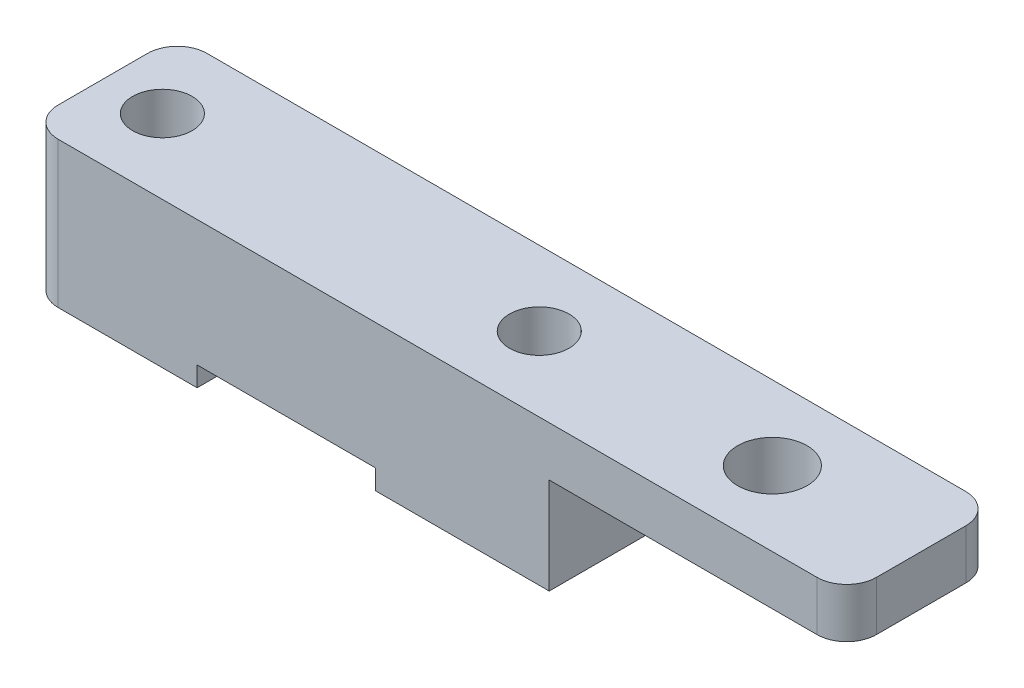
ISO-10303-21;
HEADER;
FILE_DESCRIPTION(('STEP AP214'),'2;1');
FILE_NAME('part.step','',(''),(''),'','','');
FILE_SCHEMA(('AUTOMOTIVE_DESIGN { 1 0 10303 214 1 1 1 1 }'));
ENDSEC;
DATA;
#1=APPLICATION_CONTEXT('core data for automotive mechanical design processes');
#2=APPLICATION_PROTOCOL_DEFINITION('international standard','automotive_design',2000,#1);
#3=PRODUCT_CONTEXT('',#1,'mechanical');
#4=PRODUCT('Part','Part','',(#3));
#5=PRODUCT_RELATED_PRODUCT_CATEGORY('part','',(#4));
#6=PRODUCT_DEFINITION_FORMATION('','',#4);
#7=PRODUCT_DEFINITION_CONTEXT('part definition',#1,'design');
#8=PRODUCT_DEFINITION('design','',#6,#7);
#9=PRODUCT_DEFINITION_SHAPE('','',#8);
#10=(LENGTH_UNIT() NAMED_UNIT(*) SI_UNIT(.MILLI.,.METRE.));
#11=(NAMED_UNIT(*) PLANE_ANGLE_UNIT() SI_UNIT($,.RADIAN.));
#12=(NAMED_UNIT(*) SI_UNIT($,.STERADIAN.) SOLID_ANGLE_UNIT());
#13=UNCERTAINTY_MEASURE_WITH_UNIT(LENGTH_MEASURE(1.E-05),#10,'distance_accuracy_value','');
#14=(GEOMETRIC_REPRESENTATION_CONTEXT(3) GLOBAL_UNCERTAINTY_ASSIGNED_CONTEXT((#13)) GLOBAL_UNIT_ASSIGNED_CONTEXT((#10,
#11,#12)) REPRESENTATION_CONTEXT('',''));
#15=CARTESIAN_POINT('',(0.,0.,0.));
#16=DIRECTION('',(0.,0.,1.));
#17=DIRECTION('',(1.,0.,0.));
#18=AXIS2_PLACEMENT_3D('',#15,#16,#17);
#19=CARTESIAN_POINT('',(16.25,2.65,0.));
#20=DIRECTION('',(0.,0.,1.));
#21=DIRECTION('',(1.,0.,0.));
#22=AXIS2_PLACEMENT_3D('',#19,#20,#21);
#23=PLANE('',#22);
#24=DIRECTION('',(0.,-1.,0.));
#25=VECTOR('',#24,1.);
#26=CARTESIAN_POINT('',(-22.,6.325,0.));
#27=LINE('',#26,#25);
#28=CARTESIAN_POINT('',(-22.,10.,0.));
#29=VERTEX_POINT('',#28);
#30=CARTESIAN_POINT('',(-22.,-4.7,0.));
#31=VERTEX_POINT('',#30);
#32=EDGE_CURVE('E307',#29,#31,#27,.T.);
#33=ORIENTED_EDGE('',*,*,#32,.F.);
#34=DIRECTION('',(1.,0.,0.));
#35=VECTOR('',#34,1.);
#36=CARTESIAN_POINT('',(10.,10.,0.));
#37=LINE('',#36,#35);
#38=CARTESIAN_POINT('',(54.5,10.,0.));
#39=VERTEX_POINT('',#38);
#40=EDGE_CURVE('E269',#29,#39,#37,.T.);
#41=ORIENTED_EDGE('',*,*,#40,.T.);
#42=DIRECTION('',(0.,1.,0.));
#43=VECTOR('',#42,1.);
#44=CARTESIAN_POINT('',(54.5,3.825,0.));
#45=LINE('',#44,#43);
#46=CARTESIAN_POINT('',(54.5,5.,0.));
#47=VERTEX_POINT('',#46);
#48=EDGE_CURVE('E193',#47,#39,#45,.T.);
#49=ORIENTED_EDGE('',*,*,#48,.F.);
#50=DIRECTION('',(-1.,0.,0.));
#51=VECTOR('',#50,1.);
#52=CARTESIAN_POINT('',(57.5,5.,0.));
#53=LINE('',#52,#51);
#54=CARTESIAN_POINT('',(27.5,5.,0.));
#55=VERTEX_POINT('',#54);
#56=EDGE_CURVE('E188',#47,#55,#53,.T.);
#57=ORIENTED_EDGE('',*,*,#56,.T.);
#58=DIRECTION('',(0.,-1.,0.));
#59=VECTOR('',#58,1.);
#60=CARTESIAN_POINT('',(27.5,5.,0.));
#61=LINE('',#60,#59);
#62=CARTESIAN_POINT('',(27.5,-4.7,0.));
#63=VERTEX_POINT('',#62);
#64=EDGE_CURVE('E181',#55,#63,#61,.T.);
#65=ORIENTED_EDGE('',*,*,#64,.T.);
#66=DIRECTION('',(-1.,0.,0.));
#67=VECTOR('',#66,1.);
#68=CARTESIAN_POINT('',(27.5,-4.7,0.));
#69=LINE('',#68,#67);
#70=CARTESIAN_POINT('',(10.,-4.7,0.));
#71=VERTEX_POINT('',#70);
#72=EDGE_CURVE('E231',#63,#71,#69,.T.);
#73=ORIENTED_EDGE('',*,*,#72,.T.);
#74=DIRECTION('',(0.,-1.,0.));
#75=VECTOR('',#74,1.);
#76=CARTESIAN_POINT('',(10.,-2.7,0.));
#77=LINE('',#76,#75);
#78=CARTESIAN_POINT('',(10.,-2.7,0.));
#79=VERTEX_POINT('',#78);
#80=EDGE_CURVE('E230',#79,#71,#77,.T.);
#81=ORIENTED_EDGE('',*,*,#80,.F.);
#82=DIRECTION('',(1.,0.,0.));
#83=VECTOR('',#82,1.);
#84=CARTESIAN_POINT('',(-8.,-2.7,0.));
#85=LINE('',#84,#83);
#86=CARTESIAN_POINT('',(-8.,-2.7,0.));
#87=VERTEX_POINT('',#86);
#88=EDGE_CURVE('E10',#87,#79,#85,.T.);
#89=ORIENTED_EDGE('',*,*,#88,.F.);
#90=DIRECTION('',(0.,1.,0.));
#91=VECTOR('',#90,1.);
#92=CARTESIAN_POINT('',(-8.,-4.7,0.));
#93=LINE('',#92,#91);
#94=CARTESIAN_POINT('',(-8.,-4.7,0.));
#95=VERTEX_POINT('',#94);
#96=EDGE_CURVE('E300',#95,#87,#93,.T.);
#97=ORIENTED_EDGE('',*,*,#96,.F.);
#98=DIRECTION('',(-1.,0.,0.));
#99=VECTOR('',#98,1.);
#100=CARTESIAN_POINT('',(-8.,-4.7,0.));
#101=LINE('',#100,#99);
#102=EDGE_CURVE('E204',#95,#31,#101,.T.);
#103=ORIENTED_EDGE('',*,*,#102,.T.);
#104=EDGE_LOOP('',(#33,#41,#49,#57,#65,#73,#81,#89,#97,#103));
#105=FACE_BOUND('',#104,.T.);
#106=ADVANCED_FACE('F15',(#105),#23,.F.);
#107=CARTESIAN_POINT('',(-8.,-2.7,0.));
#108=DIRECTION('',(0.,-1.,0.));
#109=DIRECTION('',(0.,0.,-1.));
#110=AXIS2_PLACEMENT_3D('',#107,#108,#109);
#111=PLANE('',#110);
#112=ORIENTED_EDGE('',*,*,#88,.T.);
#113=DIRECTION('',(0.,0.,1.));
#114=VECTOR('',#113,1.);
#115=CARTESIAN_POINT('',(10.,-2.7,0.));
#116=LINE('',#115,#114);
#117=CARTESIAN_POINT('',(10.,-2.7,15.));
#118=VERTEX_POINT('',#117);
#119=EDGE_CURVE('E26',#79,#118,#116,.T.);
#120=ORIENTED_EDGE('',*,*,#119,.T.);
#121=DIRECTION('',(1.,0.,0.));
#122=VECTOR('',#121,1.);
#123=CARTESIAN_POINT('',(-8.,-2.7,15.));
#124=LINE('',#123,#122);
#125=CARTESIAN_POINT('',(-8.,-2.7,15.));
#126=VERTEX_POINT('',#125);
#127=EDGE_CURVE('E268',#126,#118,#124,.T.);
#128=ORIENTED_EDGE('',*,*,#127,.F.);
#129=DIRECTION('',(0.,0.,1.));
#130=VECTOR('',#129,1.);
#131=CARTESIAN_POINT('',(-8.,-2.7,0.));
#132=LINE('',#131,#130);
#133=EDGE_CURVE('E235',#87,#126,#132,.T.);
#134=ORIENTED_EDGE('',*,*,#133,.F.);
#135=EDGE_LOOP('',(#112,#120,#128,#134));
#136=FACE_BOUND('',#135,.T.);
#137=ADVANCED_FACE('F440',(#136),#111,.T.);
#138=CARTESIAN_POINT('',(10.,-2.7,0.));
#139=DIRECTION('',(-1.,0.,0.));
#140=DIRECTION('',(0.,0.,1.));
#141=AXIS2_PLACEMENT_3D('',#138,#139,#140);
#142=PLANE('',#141);
#143=ORIENTED_EDGE('',*,*,#80,.T.);
#144=DIRECTION('',(0.,0.,1.));
#145=VECTOR('',#144,1.);
#146=CARTESIAN_POINT('',(10.,-4.7,0.));
#147=LINE('',#146,#145);
#148=CARTESIAN_POINT('',(10.,-4.7,15.));
#149=VERTEX_POINT('',#148);
#150=EDGE_CURVE('E228',#71,#149,#147,.T.);
#151=ORIENTED_EDGE('',*,*,#150,.T.);
#152=DIRECTION('',(0.,-1.,0.));
#153=VECTOR('',#152,1.);
#154=CARTESIAN_POINT('',(10.,-2.7,15.));
#155=LINE('',#154,#153);
#156=EDGE_CURVE('E358',#118,#149,#155,.T.);
#157=ORIENTED_EDGE('',*,*,#156,.F.);
#158=ORIENTED_EDGE('',*,*,#119,.F.);
#159=EDGE_LOOP('',(#143,#151,#157,#158));
#160=FACE_BOUND('',#159,.T.);
#161=ADVANCED_FACE('F434',(#160),#142,.T.);
#162=CARTESIAN_POINT('',(10.,-4.7,0.));
#163=DIRECTION('',(0.,-1.,0.));
#164=DIRECTION('',(0.,0.,-1.));
#165=AXIS2_PLACEMENT_3D('',#162,#163,#164);
#166=PLANE('',#165);
#167=CARTESIAN_POINT('',(19.,-4.7,7.5));
#168=DIRECTION('',(0.,1.,0.));
#169=DIRECTION('',(-1.,0.,0.));
#170=AXIS2_PLACEMENT_3D('',#167,#168,#169);
#171=CIRCLE('',#170,3.);
#172=CARTESIAN_POINT('',(22.,-4.7,7.5));
#173=VERTEX_POINT('',#172);
#174=EDGE_CURVE('E221',#173,#173,#171,.T.);
#175=ORIENTED_EDGE('',*,*,#174,.T.);
#176=EDGE_LOOP('',(#175));
#177=FACE_BOUND('',#176,.T.);
#178=ORIENTED_EDGE('',*,*,#72,.F.);
#179=DIRECTION('',(0.,0.,1.));
#180=VECTOR('',#179,1.);
#181=CARTESIAN_POINT('',(27.5,-4.7,0.));
#182=LINE('',#181,#180);
#183=CARTESIAN_POINT('',(27.5,-4.7,15.));
#184=VERTEX_POINT('',#183);
#185=EDGE_CURVE('E184',#63,#184,#182,.T.);
#186=ORIENTED_EDGE('',*,*,#185,.T.);
#187=DIRECTION('',(1.,0.,0.));
#188=VECTOR('',#187,1.);
#189=CARTESIAN_POINT('',(27.5,-4.7,15.));
#190=LINE('',#189,#188);
#191=EDGE_CURVE('E214',#149,#184,#190,.T.);
#192=ORIENTED_EDGE('',*,*,#191,.F.);
#193=ORIENTED_EDGE('',*,*,#150,.F.);
#194=EDGE_LOOP('',(#178,#186,#192,#193));
#195=FACE_BOUND('',#194,.T.);
#196=ADVANCED_FACE('F17',(#177,#195),#166,.T.);
#197=CARTESIAN_POINT('',(27.5,-4.7,0.));
#198=DIRECTION('',(1.,0.,0.));
#199=DIRECTION('',(0.,1.,0.));
#200=AXIS2_PLACEMENT_3D('',#197,#198,#199);
#201=PLANE('',#200);
#202=ORIENTED_EDGE('',*,*,#64,.F.);
#203=DIRECTION('',(0.,0.,1.));
#204=VECTOR('',#203,1.);
#205=CARTESIAN_POINT('',(27.5,5.,0.));
#206=LINE('',#205,#204);
#207=CARTESIAN_POINT('',(27.5,5.,15.));
#208=VERTEX_POINT('',#207);
#209=EDGE_CURVE('E137',#55,#208,#206,.T.);
#210=ORIENTED_EDGE('',*,*,#209,.T.);
#211=DIRECTION('',(0.,1.,0.));
#212=VECTOR('',#211,1.);
#213=CARTESIAN_POINT('',(27.5,5.,15.));
#214=LINE('',#213,#212);
#215=EDGE_CURVE('E19',#184,#208,#214,.T.);
#216=ORIENTED_EDGE('',*,*,#215,.F.);
#217=ORIENTED_EDGE('',*,*,#185,.F.);
#218=EDGE_LOOP('',(#202,#210,#216,#217));
#219=FACE_BOUND('',#218,.T.);
#220=ADVANCED_FACE('F183',(#219),#201,.T.);
#221=CARTESIAN_POINT('',(27.5,5.,0.));
#222=DIRECTION('',(0.,-1.,0.));
#223=DIRECTION('',(0.,0.,-1.));
#224=AXIS2_PLACEMENT_3D('',#221,#222,#223);
#225=PLANE('',#224);
#226=CARTESIAN_POINT('',(42.5,5.,7.5));
#227=DIRECTION('',(0.,1.,0.));
#228=DIRECTION('',(-1.,0.,0.));
#229=AXIS2_PLACEMENT_3D('',#226,#227,#228);
#230=CIRCLE('',#229,3.5);
#231=CARTESIAN_POINT('',(46.,5.,7.5));
#232=VERTEX_POINT('',#231);
#233=EDGE_CURVE('E147',#232,#232,#230,.T.);
#234=ORIENTED_EDGE('',*,*,#233,.T.);
#235=EDGE_LOOP('',(#234));
#236=FACE_BOUND('',#235,.T.);
#237=CARTESIAN_POINT('',(54.5,5.,3.));
#238=DIRECTION('',(0.,1.,0.));
#239=DIRECTION('',(0.707106781186546,0.,-0.707106781186549));
#240=AXIS2_PLACEMENT_3D('',#237,#238,#239);
#241=CIRCLE('',#240,3.);
#242=CARTESIAN_POINT('',(57.5,5.,3.));
#243=VERTEX_POINT('',#242);
#244=EDGE_CURVE('E283',#243,#47,#241,.T.);
#245=ORIENTED_EDGE('',*,*,#244,.F.);
#246=DIRECTION('',(0.,0.,1.));
#247=VECTOR('',#246,1.);
#248=CARTESIAN_POINT('',(57.5,5.,0.));
#249=LINE('',#248,#247);
#250=CARTESIAN_POINT('',(57.5,5.,12.));
#251=VERTEX_POINT('',#250);
#252=EDGE_CURVE('E276',#243,#251,#249,.T.);
#253=ORIENTED_EDGE('',*,*,#252,.T.);
#254=CARTESIAN_POINT('',(54.5,5.,12.));
#255=DIRECTION('',(0.,1.,0.));
#256=DIRECTION('',(0.707106781186546,0.,0.707106781186549));
#257=AXIS2_PLACEMENT_3D('',#254,#255,#256);
#258=CIRCLE('',#257,3.);
#259=CARTESIAN_POINT('',(54.5,5.,15.));
#260=VERTEX_POINT('',#259);
#261=EDGE_CURVE('E249',#260,#251,#258,.T.);
#262=ORIENTED_EDGE('',*,*,#261,.F.);
#263=DIRECTION('',(1.,0.,0.));
#264=VECTOR('',#263,1.);
#265=CARTESIAN_POINT('',(57.5,5.,15.));
#266=LINE('',#265,#264);
#267=EDGE_CURVE('E201',#208,#260,#266,.T.);
#268=ORIENTED_EDGE('',*,*,#267,.F.);
#269=ORIENTED_EDGE('',*,*,#209,.F.);
#270=ORIENTED_EDGE('',*,*,#56,.F.);
#271=EDGE_LOOP('',(#245,#253,#262,#268,#269,#270));
#272=FACE_BOUND('',#271,.T.);
#273=ADVANCED_FACE('F199',(#236,#272),#225,.T.);
#274=CARTESIAN_POINT('',(-25.,-4.7,0.));
#275=DIRECTION('',(0.,-1.,0.));
#276=DIRECTION('',(0.,0.,-1.));
#277=AXIS2_PLACEMENT_3D('',#274,#275,#276);
#278=PLANE('',#277);
#279=CARTESIAN_POINT('',(-19.,-4.7,7.5));
#280=DIRECTION('',(0.,1.,0.));
#281=DIRECTION('',(-1.,0.,0.));
#282=AXIS2_PLACEMENT_3D('',#279,#280,#281);
#283=CIRCLE('',#282,3.);
#284=CARTESIAN_POINT('',(-16.,-4.7,7.5));
#285=VERTEX_POINT('',#284);
#286=EDGE_CURVE('E220',#285,#285,#283,.T.);
#287=ORIENTED_EDGE('',*,*,#286,.T.);
#288=EDGE_LOOP('',(#287));
#289=FACE_BOUND('',#288,.T.);
#290=CARTESIAN_POINT('',(-22.,-4.7,3.));
#291=DIRECTION('',(0.,1.,0.));
#292=DIRECTION('',(-0.707106781186547,0.,-0.707106781186548));
#293=AXIS2_PLACEMENT_3D('',#290,#291,#292);
#294=CIRCLE('',#293,3.);
#295=CARTESIAN_POINT('',(-25.,-4.7,3.));
#296=VERTEX_POINT('',#295);
#297=EDGE_CURVE('E227',#31,#296,#294,.T.);
#298=ORIENTED_EDGE('',*,*,#297,.F.);
#299=ORIENTED_EDGE('',*,*,#102,.F.);
#300=DIRECTION('',(0.,0.,1.));
#301=VECTOR('',#300,1.);
#302=CARTESIAN_POINT('',(-8.,-4.7,0.));
#303=LINE('',#302,#301);
#304=CARTESIAN_POINT('',(-8.,-4.7,15.));
#305=VERTEX_POINT('',#304);
#306=EDGE_CURVE('E210',#95,#305,#303,.T.);
#307=ORIENTED_EDGE('',*,*,#306,.T.);
#308=DIRECTION('',(1.,0.,0.));
#309=VECTOR('',#308,1.);
#310=CARTESIAN_POINT('',(-8.,-4.7,15.));
#311=LINE('',#310,#309);
#312=CARTESIAN_POINT('',(-22.,-4.7,15.));
#313=VERTEX_POINT('',#312);
#314=EDGE_CURVE('E252',#313,#305,#311,.T.);
#315=ORIENTED_EDGE('',*,*,#314,.F.);
#316=CARTESIAN_POINT('',(-22.,-4.7,12.));
#317=DIRECTION('',(0.,1.,0.));
#318=DIRECTION('',(-0.707106781186547,0.,0.707106781186548));
#319=AXIS2_PLACEMENT_3D('',#316,#317,#318);
#320=CIRCLE('',#319,3.);
#321=CARTESIAN_POINT('',(-25.,-4.7,12.));
#322=VERTEX_POINT('',#321);
#323=EDGE_CURVE('E244',#322,#313,#320,.T.);
#324=ORIENTED_EDGE('',*,*,#323,.F.);
#325=DIRECTION('',(0.,0.,1.));
#326=VECTOR('',#325,1.);
#327=CARTESIAN_POINT('',(-25.,-4.7,0.));
#328=LINE('',#327,#326);
#329=EDGE_CURVE('E245',#296,#322,#328,.T.);
#330=ORIENTED_EDGE('',*,*,#329,.F.);
#331=EDGE_LOOP('',(#298,#299,#307,#315,#324,#330));
#332=FACE_BOUND('',#331,.T.);
#333=ADVANCED_FACE('F411',(#289,#332),#278,.T.);
#334=CARTESIAN_POINT('',(-8.,-4.7,0.));
#335=DIRECTION('',(1.,0.,0.));
#336=DIRECTION('',(0.,1.,0.));
#337=AXIS2_PLACEMENT_3D('',#334,#335,#336);
#338=PLANE('',#337);
#339=ORIENTED_EDGE('',*,*,#96,.T.);
#340=ORIENTED_EDGE('',*,*,#133,.T.);
#341=DIRECTION('',(0.,1.,0.));
#342=VECTOR('',#341,1.);
#343=CARTESIAN_POINT('',(-8.,-4.7,15.));
#344=LINE('',#343,#342);
#345=EDGE_CURVE('E264',#305,#126,#344,.T.);
#346=ORIENTED_EDGE('',*,*,#345,.F.);
#347=ORIENTED_EDGE('',*,*,#306,.F.);
#348=EDGE_LOOP('',(#339,#340,#346,#347));
#349=FACE_BOUND('',#348,.T.);
#350=ADVANCED_FACE('F444',(#349),#338,.T.);
#351=CARTESIAN_POINT('',(-19.,10.,7.5));
#352=DIRECTION('',(0.,-1.,0.));
#353=DIRECTION('',(-1.,0.,0.));
#354=AXIS2_PLACEMENT_3D('',#351,#352,#353);
#355=CYLINDRICAL_SURFACE('',#354,3.);
#356=CARTESIAN_POINT('',(-19.,10.,7.5));
#357=DIRECTION('',(0.,-1.,0.));
#358=DIRECTION('',(-1.,0.,0.));
#359=AXIS2_PLACEMENT_3D('',#356,#357,#358);
#360=CIRCLE('',#359,3.);
#361=CARTESIAN_POINT('',(-16.,10.,7.5));
#362=VERTEX_POINT('',#361);
#363=EDGE_CURVE('E257',#362,#362,#360,.T.);
#364=ORIENTED_EDGE('',*,*,#363,.F.);
#365=DIRECTION('',(0.,-1.,0.));
#366=VECTOR('',#365,1.);
#367=CARTESIAN_POINT('',(-16.,10.,7.5));
#368=LINE('',#367,#366);
#369=EDGE_CURVE('E216',#362,#285,#368,.T.);
#370=ORIENTED_EDGE('',*,*,#369,.T.);
#371=ORIENTED_EDGE('',*,*,#286,.F.);
#372=ORIENTED_EDGE('',*,*,#369,.F.);
#373=EDGE_LOOP('',(#364,#370,#371,#372));
#374=FACE_BOUND('',#373,.T.);
#375=ADVANCED_FACE('F425',(#374),#355,.F.);
#376=CARTESIAN_POINT('',(19.,10.,7.5));
#377=DIRECTION('',(0.,-1.,0.));
#378=DIRECTION('',(-1.,0.,0.));
#379=AXIS2_PLACEMENT_3D('',#376,#377,#378);
#380=CYLINDRICAL_SURFACE('',#379,3.);
#381=CARTESIAN_POINT('',(19.,10.,7.5));
#382=DIRECTION('',(0.,-1.,0.));
#383=DIRECTION('',(-1.,0.,0.));
#384=AXIS2_PLACEMENT_3D('',#381,#382,#383);
#385=CIRCLE('',#384,3.);
#386=CARTESIAN_POINT('',(22.,10.,7.5));
#387=VERTEX_POINT('',#386);
#388=EDGE_CURVE('E253',#387,#387,#385,.T.);
#389=ORIENTED_EDGE('',*,*,#388,.F.);
#390=DIRECTION('',(0.,-1.,0.));
#391=VECTOR('',#390,1.);
#392=CARTESIAN_POINT('',(22.,10.,7.5));
#393=LINE('',#392,#391);
#394=EDGE_CURVE('E236',#387,#173,#393,.T.);
#395=ORIENTED_EDGE('',*,*,#394,.T.);
#396=ORIENTED_EDGE('',*,*,#174,.F.);
#397=ORIENTED_EDGE('',*,*,#394,.F.);
#398=EDGE_LOOP('',(#389,#395,#396,#397));
#399=FACE_BOUND('',#398,.T.);
#400=ADVANCED_FACE('F429',(#399),#380,.F.);
#401=CARTESIAN_POINT('',(42.5,10.,7.5));
#402=DIRECTION('',(0.,-1.,0.));
#403=DIRECTION('',(-1.,0.,0.));
#404=AXIS2_PLACEMENT_3D('',#401,#402,#403);
#405=CYLINDRICAL_SURFACE('',#404,3.5);
#406=CARTESIAN_POINT('',(42.5,10.,7.5));
#407=DIRECTION('',(0.,-1.,0.));
#408=DIRECTION('',(-1.,0.,0.));
#409=AXIS2_PLACEMENT_3D('',#406,#407,#408);
#410=CIRCLE('',#409,3.5);
#411=CARTESIAN_POINT('',(46.,10.,7.5));
#412=VERTEX_POINT('',#411);
#413=EDGE_CURVE('E258',#412,#412,#410,.T.);
#414=ORIENTED_EDGE('',*,*,#413,.F.);
#415=DIRECTION('',(0.,-1.,0.));
#416=VECTOR('',#415,1.);
#417=CARTESIAN_POINT('',(46.,10.,7.5));
#418=LINE('',#417,#416);
#419=EDGE_CURVE('E248',#412,#232,#418,.T.);
#420=ORIENTED_EDGE('',*,*,#419,.T.);
#421=ORIENTED_EDGE('',*,*,#233,.F.);
#422=ORIENTED_EDGE('',*,*,#419,.F.);
#423=EDGE_LOOP('',(#414,#420,#421,#422));
#424=FACE_BOUND('',#423,.T.);
#425=ADVANCED_FACE('F390',(#424),#405,.F.);
#426=CARTESIAN_POINT('',(16.25,2.65,15.));
#427=DIRECTION('',(0.,0.,1.));
#428=DIRECTION('',(1.,0.,0.));
#429=AXIS2_PLACEMENT_3D('',#426,#427,#428);
#430=PLANE('',#429);
#431=DIRECTION('',(0.,1.,0.));
#432=VECTOR('',#431,1.);
#433=CARTESIAN_POINT('',(-22.,6.325,15.));
#434=LINE('',#433,#432);
#435=CARTESIAN_POINT('',(-22.,10.,15.));
#436=VERTEX_POINT('',#435);
#437=EDGE_CURVE('E74',#313,#436,#434,.T.);
#438=ORIENTED_EDGE('',*,*,#437,.F.);
#439=ORIENTED_EDGE('',*,*,#314,.T.);
#440=ORIENTED_EDGE('',*,*,#345,.T.);
#441=ORIENTED_EDGE('',*,*,#127,.T.);
#442=ORIENTED_EDGE('',*,*,#156,.T.);
#443=ORIENTED_EDGE('',*,*,#191,.T.);
#444=ORIENTED_EDGE('',*,*,#215,.T.);
#445=ORIENTED_EDGE('',*,*,#267,.T.);
#446=DIRECTION('',(0.,-1.,0.));
#447=VECTOR('',#446,1.);
#448=CARTESIAN_POINT('',(54.5,3.825,15.));
#449=LINE('',#448,#447);
#450=CARTESIAN_POINT('',(54.5,10.,15.));
#451=VERTEX_POINT('',#450);
#452=EDGE_CURVE('E57',#451,#260,#449,.T.);
#453=ORIENTED_EDGE('',*,*,#452,.F.);
#454=DIRECTION('',(-1.,0.,0.));
#455=VECTOR('',#454,1.);
#456=CARTESIAN_POINT('',(10.,10.,15.));
#457=LINE('',#456,#455);
#458=EDGE_CURVE('E263',#451,#436,#457,.T.);
#459=ORIENTED_EDGE('',*,*,#458,.T.);
#460=EDGE_LOOP('',(#438,#439,#440,#441,#442,#443,#444,#445,#453,#459));
#461=FACE_BOUND('',#460,.T.);
#462=ADVANCED_FACE('F408',(#461),#430,.T.);
#463=CARTESIAN_POINT('',(54.5,3.825,12.));
#464=DIRECTION('',(0.,1.,0.));
#465=DIRECTION('',(0.707106781186546,0.,0.707106781186549));
#466=AXIS2_PLACEMENT_3D('',#463,#464,#465);
#467=CYLINDRICAL_SURFACE('',#466,3.);
#468=CARTESIAN_POINT('',(54.5,10.,12.));
#469=DIRECTION('',(0.,-1.,0.));
#470=DIRECTION('',(0.707106781186546,0.,0.707106781186549));
#471=AXIS2_PLACEMENT_3D('',#468,#469,#470);
#472=CIRCLE('',#471,3.);
#473=CARTESIAN_POINT('',(57.5,10.,12.));
#474=VERTEX_POINT('',#473);
#475=EDGE_CURVE('E259',#474,#451,#472,.T.);
#476=ORIENTED_EDGE('',*,*,#475,.T.);
#477=ORIENTED_EDGE('',*,*,#452,.T.);
#478=ORIENTED_EDGE('',*,*,#261,.T.);
#479=DIRECTION('',(0.,1.,0.));
#480=VECTOR('',#479,1.);
#481=CARTESIAN_POINT('',(57.5,3.825,12.));
#482=LINE('',#481,#480);
#483=EDGE_CURVE('E273',#251,#474,#482,.T.);
#484=ORIENTED_EDGE('',*,*,#483,.T.);
#485=EDGE_LOOP('',(#476,#477,#478,#484));
#486=FACE_BOUND('',#485,.T.);
#487=ADVANCED_FACE('F351',(#486),#467,.T.);
#488=CARTESIAN_POINT('',(57.5,5.,0.));
#489=DIRECTION('',(1.,0.,0.));
#490=DIRECTION('',(0.,1.,0.));
#491=AXIS2_PLACEMENT_3D('',#488,#489,#490);
#492=PLANE('',#491);
#493=DIRECTION('',(0.,-1.,0.));
#494=VECTOR('',#493,1.);
#495=CARTESIAN_POINT('',(57.5,3.825,3.));
#496=LINE('',#495,#494);
#497=CARTESIAN_POINT('',(57.5,10.,3.));
#498=VERTEX_POINT('',#497);
#499=EDGE_CURVE('E277',#498,#243,#496,.T.);
#500=ORIENTED_EDGE('',*,*,#499,.F.);
#501=DIRECTION('',(0.,0.,1.));
#502=VECTOR('',#501,1.);
#503=CARTESIAN_POINT('',(57.5,10.,0.));
#504=LINE('',#503,#502);
#505=EDGE_CURVE('E262',#498,#474,#504,.T.);
#506=ORIENTED_EDGE('',*,*,#505,.T.);
#507=ORIENTED_EDGE('',*,*,#483,.F.);
#508=ORIENTED_EDGE('',*,*,#252,.F.);
#509=EDGE_LOOP('',(#500,#506,#507,#508));
#510=FACE_BOUND('',#509,.T.);
#511=ADVANCED_FACE('F347',(#510),#492,.T.);
#512=CARTESIAN_POINT('',(54.5,3.825,3.));
#513=DIRECTION('',(0.,-1.,0.));
#514=DIRECTION('',(0.707106781186546,0.,-0.707106781186549));
#515=AXIS2_PLACEMENT_3D('',#512,#513,#514);
#516=CYLINDRICAL_SURFACE('',#515,3.);
#517=ORIENTED_EDGE('',*,*,#244,.T.);
#518=ORIENTED_EDGE('',*,*,#48,.T.);
#519=CARTESIAN_POINT('',(54.5,10.,3.));
#520=DIRECTION('',(0.,-1.,0.));
#521=DIRECTION('',(0.707106781186546,0.,-0.707106781186549));
#522=AXIS2_PLACEMENT_3D('',#519,#520,#521);
#523=CIRCLE('',#522,3.);
#524=EDGE_CURVE('E272',#39,#498,#523,.T.);
#525=ORIENTED_EDGE('',*,*,#524,.T.);
#526=ORIENTED_EDGE('',*,*,#499,.T.);
#527=EDGE_LOOP('',(#517,#518,#525,#526));
#528=FACE_BOUND('',#527,.T.);
#529=ADVANCED_FACE('F340',(#528),#516,.T.);
#530=CARTESIAN_POINT('',(-22.,6.325,12.));
#531=DIRECTION('',(0.,-1.,0.));
#532=DIRECTION('',(-0.707106781186547,0.,0.707106781186548));
#533=AXIS2_PLACEMENT_3D('',#530,#531,#532);
#534=CYLINDRICAL_SURFACE('',#533,3.);
#535=ORIENTED_EDGE('',*,*,#323,.T.);
#536=ORIENTED_EDGE('',*,*,#437,.T.);
#537=CARTESIAN_POINT('',(-22.,10.,12.));
#538=DIRECTION('',(0.,-1.,0.));
#539=DIRECTION('',(-0.707106781186547,0.,0.707106781186548));
#540=AXIS2_PLACEMENT_3D('',#537,#538,#539);
#541=CIRCLE('',#540,3.);
#542=CARTESIAN_POINT('',(-25.,10.,12.));
#543=VERTEX_POINT('',#542);
#544=EDGE_CURVE('E335',#436,#543,#541,.T.);
#545=ORIENTED_EDGE('',*,*,#544,.T.);
#546=DIRECTION('',(0.,-1.,0.));
#547=VECTOR('',#546,1.);
#548=CARTESIAN_POINT('',(-25.,6.325,12.));
#549=LINE('',#548,#547);
#550=EDGE_CURVE('E240',#543,#322,#549,.T.);
#551=ORIENTED_EDGE('',*,*,#550,.T.);
#552=EDGE_LOOP('',(#535,#536,#545,#551));
#553=FACE_BOUND('',#552,.T.);
#554=ADVANCED_FACE('F407',(#553),#534,.T.);
#555=CARTESIAN_POINT('',(-25.,10.,0.));
#556=DIRECTION('',(-1.,0.,0.));
#557=DIRECTION('',(0.,0.,1.));
#558=AXIS2_PLACEMENT_3D('',#555,#556,#557);
#559=PLANE('',#558);
#560=DIRECTION('',(0.,1.,0.));
#561=VECTOR('',#560,1.);
#562=CARTESIAN_POINT('',(-25.,6.325,3.));
#563=LINE('',#562,#561);
#564=CARTESIAN_POINT('',(-25.,10.,3.));
#565=VERTEX_POINT('',#564);
#566=EDGE_CURVE('E222',#296,#565,#563,.T.);
#567=ORIENTED_EDGE('',*,*,#566,.F.);
#568=ORIENTED_EDGE('',*,*,#329,.T.);
#569=ORIENTED_EDGE('',*,*,#550,.F.);
#570=DIRECTION('',(0.,0.,1.));
#571=VECTOR('',#570,1.);
#572=CARTESIAN_POINT('',(-25.,10.,0.));
#573=LINE('',#572,#571);
#574=EDGE_CURVE('E226',#565,#543,#573,.T.);
#575=ORIENTED_EDGE('',*,*,#574,.F.);
#576=EDGE_LOOP('',(#567,#568,#569,#575));
#577=FACE_BOUND('',#576,.T.);
#578=ADVANCED_FACE('F396',(#577),#559,.T.);
#579=CARTESIAN_POINT('',(57.5,10.,0.));
#580=DIRECTION('',(0.,1.,0.));
#581=DIRECTION('',(1.,0.,0.));
#582=AXIS2_PLACEMENT_3D('',#579,#580,#581);
#583=PLANE('',#582);
#584=ORIENTED_EDGE('',*,*,#363,.T.);
#585=EDGE_LOOP('',(#584));
#586=FACE_BOUND('',#585,.T.);
#587=ORIENTED_EDGE('',*,*,#388,.T.);
#588=EDGE_LOOP('',(#587));
#589=FACE_BOUND('',#588,.T.);
#590=ORIENTED_EDGE('',*,*,#413,.T.);
#591=EDGE_LOOP('',(#590));
#592=FACE_BOUND('',#591,.T.);
#593=CARTESIAN_POINT('',(-22.,10.,3.));
#594=DIRECTION('',(0.,-1.,0.));
#595=DIRECTION('',(-0.707106781186547,0.,-0.707106781186548));
#596=AXIS2_PLACEMENT_3D('',#593,#594,#595);
#597=CIRCLE('',#596,3.);
#598=EDGE_CURVE('E303',#565,#29,#597,.T.);
#599=ORIENTED_EDGE('',*,*,#598,.F.);
#600=ORIENTED_EDGE('',*,*,#574,.T.);
#601=ORIENTED_EDGE('',*,*,#544,.F.);
#602=ORIENTED_EDGE('',*,*,#458,.F.);
#603=ORIENTED_EDGE('',*,*,#475,.F.);
#604=ORIENTED_EDGE('',*,*,#505,.F.);
#605=ORIENTED_EDGE('',*,*,#524,.F.);
#606=ORIENTED_EDGE('',*,*,#40,.F.);
#607=EDGE_LOOP('',(#599,#600,#601,#602,#603,#604,#605,#606));
#608=FACE_BOUND('',#607,.T.);
#609=ADVANCED_FACE('F392',(#586,#589,#592,#608),#583,.T.);
#610=CARTESIAN_POINT('',(-22.,6.325,3.));
#611=DIRECTION('',(0.,1.,0.));
#612=DIRECTION('',(-0.707106781186547,0.,-0.707106781186548));
#613=AXIS2_PLACEMENT_3D('',#610,#611,#612);
#614=CYLINDRICAL_SURFACE('',#613,3.);
#615=ORIENTED_EDGE('',*,*,#598,.T.);
#616=ORIENTED_EDGE('',*,*,#32,.T.);
#617=ORIENTED_EDGE('',*,*,#297,.T.);
#618=ORIENTED_EDGE('',*,*,#566,.T.);
#619=EDGE_LOOP('',(#615,#616,#617,#618));
#620=FACE_BOUND('',#619,.T.);
#621=ADVANCED_FACE('F395',(#620),#614,.T.);
#622=CLOSED_SHELL('',(#106,#137,#161,#196,#220,#273,#333,#350,#375,#400,#425,#462,#487,#511,
#529,#554,#578,#609,#621));
#623=MANIFOLD_SOLID_BREP('B1',#622);
#624=ADVANCED_BREP_SHAPE_REPRESENTATION('',(#18,#623),#14);
#625=SHAPE_DEFINITION_REPRESENTATION(#9,#624);
ENDSEC;
END-ISO-10303-21;
